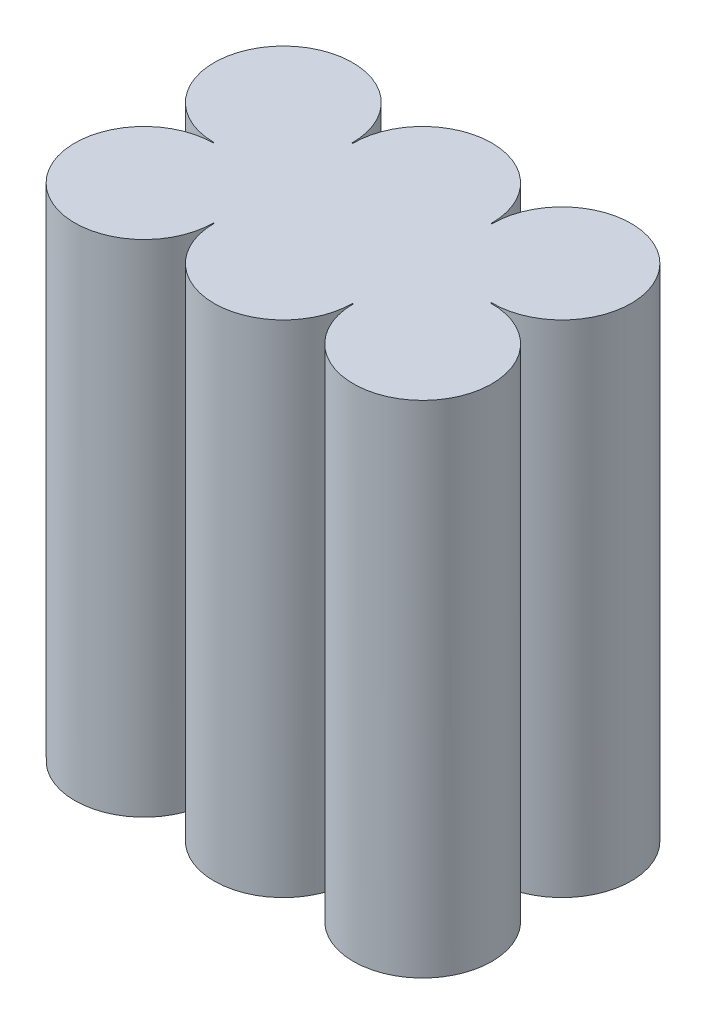
ISO-10303-21;
HEADER;
FILE_DESCRIPTION(('STEP AP214'),'2;1');
FILE_NAME('part.step','',(''),(''),'','','');
FILE_SCHEMA(('AUTOMOTIVE_DESIGN { 1 0 10303 214 1 1 1 1 }'));
ENDSEC;
DATA;
#1=APPLICATION_CONTEXT('core data for automotive mechanical design processes');
#2=APPLICATION_PROTOCOL_DEFINITION('international standard','automotive_design',2000,#1);
#3=PRODUCT_CONTEXT('',#1,'mechanical');
#4=PRODUCT('Part','Part','',(#3));
#5=PRODUCT_RELATED_PRODUCT_CATEGORY('part','',(#4));
#6=PRODUCT_DEFINITION_FORMATION('','',#4);
#7=PRODUCT_DEFINITION_CONTEXT('part definition',#1,'design');
#8=PRODUCT_DEFINITION('design','',#6,#7);
#9=PRODUCT_DEFINITION_SHAPE('','',#8);
#10=(LENGTH_UNIT() NAMED_UNIT(*) SI_UNIT(.MILLI.,.METRE.));
#11=(NAMED_UNIT(*) PLANE_ANGLE_UNIT() SI_UNIT($,.RADIAN.));
#12=(NAMED_UNIT(*) SI_UNIT($,.STERADIAN.) SOLID_ANGLE_UNIT());
#13=UNCERTAINTY_MEASURE_WITH_UNIT(LENGTH_MEASURE(1.E-05),#10,'distance_accuracy_value','');
#14=(GEOMETRIC_REPRESENTATION_CONTEXT(3) GLOBAL_UNCERTAINTY_ASSIGNED_CONTEXT((#13)) GLOBAL_UNIT_ASSIGNED_CONTEXT((#10,
#11,#12)) REPRESENTATION_CONTEXT('',''));
#15=CARTESIAN_POINT('',(0.,0.,0.));
#16=DIRECTION('',(0.,0.,1.));
#17=DIRECTION('',(1.,0.,0.));
#18=AXIS2_PLACEMENT_3D('',#15,#16,#17);
#19=CARTESIAN_POINT('',(36.,55.,0.));
#20=DIRECTION('',(1.,0.,0.));
#21=DIRECTION('',(0.,0.,-1.));
#22=AXIS2_PLACEMENT_3D('',#19,#20,#21);
#23=PLANE('',#22);
#24=DIRECTION('',(0.,0.,-1.));
#25=VECTOR('',#24,1.);
#26=CARTESIAN_POINT('',(36.,55.,0.));
#27=LINE('',#26,#25);
#28=CARTESIAN_POINT('',(36.,55.,-8.99777750336159));
#29=VERTEX_POINT('',#28);
#30=CARTESIAN_POINT('',(36.,55.,-9.10222249663841));
#31=VERTEX_POINT('',#30);
#32=EDGE_CURVE('E189',#29,#31,#27,.T.);
#33=ORIENTED_EDGE('',*,*,#32,.T.);
#34=DIRECTION('',(0.,-1.,0.));
#35=VECTOR('',#34,1.);
#36=CARTESIAN_POINT('',(36.,65.,-9.10222249663841));
#37=LINE('',#36,#35);
#38=CARTESIAN_POINT('',(36.,65.,-9.10222249663841));
#39=VERTEX_POINT('',#38);
#40=EDGE_CURVE('E56',#31,#39,#37,.F.);
#41=ORIENTED_EDGE('',*,*,#40,.T.);
#42=DIRECTION('',(0.,0.,-1.));
#43=VECTOR('',#42,1.);
#44=CARTESIAN_POINT('',(36.,65.,0.));
#45=LINE('',#44,#43);
#46=CARTESIAN_POINT('',(36.,65.,-8.99777750336159));
#47=VERTEX_POINT('',#46);
#48=EDGE_CURVE('E144',#47,#39,#45,.T.);
#49=ORIENTED_EDGE('',*,*,#48,.F.);
#50=DIRECTION('',(0.,-1.,0.));
#51=VECTOR('',#50,1.);
#52=CARTESIAN_POINT('',(36.,65.,-8.99777750336159));
#53=LINE('',#52,#51);
#54=EDGE_CURVE('E265',#47,#29,#53,.T.);
#55=ORIENTED_EDGE('',*,*,#54,.T.);
#56=EDGE_LOOP('',(#33,#41,#49,#55));
#57=FACE_BOUND('',#56,.T.);
#58=ADVANCED_FACE('F41',(#57),#23,.T.);
#59=CARTESIAN_POINT('',(0.,55.,-18.));
#60=DIRECTION('',(0.,0.,-1.));
#61=DIRECTION('',(-1.,0.,0.));
#62=AXIS2_PLACEMENT_3D('',#59,#60,#61);
#63=PLANE('',#62);
#64=DIRECTION('',(-1.,0.,0.));
#65=VECTOR('',#64,1.);
#66=CARTESIAN_POINT('',(0.,65.,-18.));
#67=LINE('',#66,#65);
#68=CARTESIAN_POINT('',(27.2005555727034,65.,-18.));
#69=VERTEX_POINT('',#68);
#70=CARTESIAN_POINT('',(27.0994444272966,65.,-18.));
#71=VERTEX_POINT('',#70);
#72=EDGE_CURVE('E140',#69,#71,#67,.T.);
#73=ORIENTED_EDGE('',*,*,#72,.F.);
#74=DIRECTION('',(0.,-1.,0.));
#75=VECTOR('',#74,1.);
#76=CARTESIAN_POINT('',(27.2005555727034,65.,-18.));
#77=LINE('',#76,#75);
#78=CARTESIAN_POINT('',(27.2005555727034,55.,-18.));
#79=VERTEX_POINT('',#78);
#80=EDGE_CURVE('E127',#69,#79,#77,.T.);
#81=ORIENTED_EDGE('',*,*,#80,.T.);
#82=DIRECTION('',(-1.,0.,0.));
#83=VECTOR('',#82,1.);
#84=CARTESIAN_POINT('',(0.,55.,-18.));
#85=LINE('',#84,#83);
#86=CARTESIAN_POINT('',(27.0994444272966,55.,-18.));
#87=VERTEX_POINT('',#86);
#88=EDGE_CURVE('E163',#79,#87,#85,.T.);
#89=ORIENTED_EDGE('',*,*,#88,.T.);
#90=DIRECTION('',(0.,-1.,0.));
#91=VECTOR('',#90,1.);
#92=CARTESIAN_POINT('',(27.0994444272966,65.,-18.));
#93=LINE('',#92,#91);
#94=EDGE_CURVE('E150',#87,#71,#93,.F.);
#95=ORIENTED_EDGE('',*,*,#94,.T.);
#96=EDGE_LOOP('',(#73,#81,#89,#95));
#97=FACE_BOUND('',#96,.T.);
#98=ADVANCED_FACE('F148',(#97),#63,.T.);
#99=CARTESIAN_POINT('',(0.,55.,0.));
#100=DIRECTION('',(0.,0.,1.));
#101=DIRECTION('',(1.,0.,0.));
#102=AXIS2_PLACEMENT_3D('',#99,#100,#101);
#103=PLANE('',#102);
#104=DIRECTION('',(1.,0.,0.));
#105=VECTOR('',#104,1.);
#106=CARTESIAN_POINT('',(0.,55.,0.));
#107=LINE('',#106,#105);
#108=CARTESIAN_POINT('',(27.1,55.,0.));
#109=VERTEX_POINT('',#108);
#110=CARTESIAN_POINT('',(27.2,55.,0.));
#111=VERTEX_POINT('',#110);
#112=EDGE_CURVE('E154',#109,#111,#107,.T.);
#113=ORIENTED_EDGE('',*,*,#112,.T.);
#114=DIRECTION('',(0.,-1.,0.));
#115=VECTOR('',#114,1.);
#116=CARTESIAN_POINT('',(27.2,65.,0.));
#117=LINE('',#116,#115);
#118=CARTESIAN_POINT('',(27.2,65.,0.));
#119=VERTEX_POINT('',#118);
#120=EDGE_CURVE('E63',#111,#119,#117,.F.);
#121=ORIENTED_EDGE('',*,*,#120,.T.);
#122=DIRECTION('',(1.,0.,0.));
#123=VECTOR('',#122,1.);
#124=CARTESIAN_POINT('',(0.,65.,0.));
#125=LINE('',#124,#123);
#126=CARTESIAN_POINT('',(27.1,65.,0.));
#127=VERTEX_POINT('',#126);
#128=EDGE_CURVE('E206',#127,#119,#125,.T.);
#129=ORIENTED_EDGE('',*,*,#128,.F.);
#130=DIRECTION('',(0.,-1.,0.));
#131=VECTOR('',#130,1.);
#132=CARTESIAN_POINT('',(27.1,65.,0.));
#133=LINE('',#132,#131);
#134=EDGE_CURVE('E196',#127,#109,#133,.T.);
#135=ORIENTED_EDGE('',*,*,#134,.T.);
#136=EDGE_LOOP('',(#113,#121,#129,#135));
#137=FACE_BOUND('',#136,.T.);
#138=ADVANCED_FACE('F193',(#137),#103,.T.);
#139=CARTESIAN_POINT('',(9.10055557270339,65.,-18.));
#140=VERTEX_POINT('',#139);
#141=CARTESIAN_POINT('',(8.99944442729661,65.,-18.));
#142=VERTEX_POINT('',#141);
#143=EDGE_CURVE('E152',#140,#142,#67,.T.);
#144=ORIENTED_EDGE('',*,*,#143,.F.);
#145=DIRECTION('',(0.,-1.,0.));
#146=VECTOR('',#145,1.);
#147=CARTESIAN_POINT('',(9.10055557270339,65.,-18.));
#148=LINE('',#147,#146);
#149=CARTESIAN_POINT('',(9.10055557270339,55.,-18.));
#150=VERTEX_POINT('',#149);
#151=EDGE_CURVE('E254',#140,#150,#148,.T.);
#152=ORIENTED_EDGE('',*,*,#151,.T.);
#153=CARTESIAN_POINT('',(8.99944442729661,55.,-18.));
#154=VERTEX_POINT('',#153);
#155=EDGE_CURVE('E203',#150,#154,#85,.T.);
#156=ORIENTED_EDGE('',*,*,#155,.T.);
#157=DIRECTION('',(0.,-1.,0.));
#158=VECTOR('',#157,1.);
#159=CARTESIAN_POINT('',(8.99944442729661,65.,-18.));
#160=LINE('',#159,#158);
#161=EDGE_CURVE('E229',#154,#142,#160,.F.);
#162=ORIENTED_EDGE('',*,*,#161,.T.);
#163=EDGE_LOOP('',(#144,#152,#156,#162));
#164=FACE_BOUND('',#163,.T.);
#165=ADVANCED_FACE('F252',(#164),#63,.T.);
#166=CARTESIAN_POINT('',(9.,55.,0.));
#167=VERTEX_POINT('',#166);
#168=CARTESIAN_POINT('',(9.1,55.,0.));
#169=VERTEX_POINT('',#168);
#170=EDGE_CURVE('E197',#167,#169,#107,.T.);
#171=ORIENTED_EDGE('',*,*,#170,.T.);
#172=DIRECTION('',(0.,-1.,0.));
#173=VECTOR('',#172,1.);
#174=CARTESIAN_POINT('',(9.1,65.,0.));
#175=LINE('',#174,#173);
#176=CARTESIAN_POINT('',(9.1,65.,0.));
#177=VERTEX_POINT('',#176);
#178=EDGE_CURVE('E217',#169,#177,#175,.F.);
#179=ORIENTED_EDGE('',*,*,#178,.T.);
#180=CARTESIAN_POINT('',(9.,65.,0.));
#181=VERTEX_POINT('',#180);
#182=EDGE_CURVE('E208',#181,#177,#125,.T.);
#183=ORIENTED_EDGE('',*,*,#182,.F.);
#184=DIRECTION('',(0.,-1.,0.));
#185=VECTOR('',#184,1.);
#186=CARTESIAN_POINT('',(9.,65.,0.));
#187=LINE('',#186,#185);
#188=EDGE_CURVE('E159',#167,#181,#187,.F.);
#189=ORIENTED_EDGE('',*,*,#188,.F.);
#190=EDGE_LOOP('',(#171,#179,#183,#189));
#191=FACE_BOUND('',#190,.T.);
#192=ADVANCED_FACE('F292',(#191),#103,.T.);
#193=CARTESIAN_POINT('',(0.,55.,0.));
#194=DIRECTION('',(-1.,0.,0.));
#195=DIRECTION('',(0.,0.,1.));
#196=AXIS2_PLACEMENT_3D('',#193,#194,#195);
#197=PLANE('',#196);
#198=DIRECTION('',(0.,0.,1.));
#199=VECTOR('',#198,1.);
#200=CARTESIAN_POINT('',(0.,65.,0.));
#201=LINE('',#200,#199);
#202=CARTESIAN_POINT('',(0.,65.,-9.1));
#203=VERTEX_POINT('',#202);
#204=CARTESIAN_POINT('',(0.,65.,-9.));
#205=VERTEX_POINT('',#204);
#206=EDGE_CURVE('E205',#203,#205,#201,.T.);
#207=ORIENTED_EDGE('',*,*,#206,.F.);
#208=DIRECTION('',(0.,-1.,0.));
#209=VECTOR('',#208,1.);
#210=CARTESIAN_POINT('',(0.,65.,-9.1));
#211=LINE('',#210,#209);
#212=CARTESIAN_POINT('',(0.,55.,-9.1));
#213=VERTEX_POINT('',#212);
#214=EDGE_CURVE('E207',#203,#213,#211,.T.);
#215=ORIENTED_EDGE('',*,*,#214,.T.);
#216=DIRECTION('',(0.,0.,1.));
#217=VECTOR('',#216,1.);
#218=CARTESIAN_POINT('',(0.,55.,0.));
#219=LINE('',#218,#217);
#220=CARTESIAN_POINT('',(0.,55.,-9.));
#221=VERTEX_POINT('',#220);
#222=EDGE_CURVE('E151',#213,#221,#219,.T.);
#223=ORIENTED_EDGE('',*,*,#222,.T.);
#224=DIRECTION('',(0.,-1.,0.));
#225=VECTOR('',#224,1.);
#226=CARTESIAN_POINT('',(0.,65.,-9.));
#227=LINE('',#226,#225);
#228=EDGE_CURVE('E162',#205,#221,#227,.T.);
#229=ORIENTED_EDGE('',*,*,#228,.F.);
#230=EDGE_LOOP('',(#207,#215,#223,#229));
#231=FACE_BOUND('',#230,.T.);
#232=ADVANCED_FACE('F237',(#231),#197,.T.);
#233=CARTESIAN_POINT('',(0.,65.,0.));
#234=DIRECTION('',(0.,-1.,0.));
#235=DIRECTION('',(0.,0.,-1.));
#236=AXIS2_PLACEMENT_3D('',#233,#234,#235);
#237=CYLINDRICAL_SURFACE('',#236,9.);
#238=CARTESIAN_POINT('',(0.,65.,0.));
#239=DIRECTION('',(0.,1.,0.));
#240=DIRECTION('',(0.,0.,1.));
#241=AXIS2_PLACEMENT_3D('',#238,#239,#240);
#242=CIRCLE('',#241,9.);
#243=EDGE_CURVE('E167',#205,#181,#242,.T.);
#244=ORIENTED_EDGE('',*,*,#243,.F.);
#245=ORIENTED_EDGE('',*,*,#228,.T.);
#246=CARTESIAN_POINT('',(0.,55.,0.));
#247=DIRECTION('',(0.,-1.,0.));
#248=DIRECTION('',(0.,0.,-1.));
#249=AXIS2_PLACEMENT_3D('',#246,#247,#248);
#250=CIRCLE('',#249,9.);
#251=EDGE_CURVE('E170',#221,#167,#250,.T.);
#252=ORIENTED_EDGE('',*,*,#251,.T.);
#253=ORIENTED_EDGE('',*,*,#188,.T.);
#254=EDGE_LOOP('',(#244,#245,#252,#253));
#255=FACE_BOUND('',#254,.T.);
#256=CARTESIAN_POINT('',(0.,0.,0.));
#257=DIRECTION('',(0.,1.,0.));
#258=DIRECTION('',(0.,0.,1.));
#259=AXIS2_PLACEMENT_3D('',#256,#257,#258);
#260=CIRCLE('',#259,9.);
#261=CARTESIAN_POINT('',(0.,0.,9.));
#262=VERTEX_POINT('',#261);
#263=EDGE_CURVE('E166',#262,#262,#260,.T.);
#264=ORIENTED_EDGE('',*,*,#263,.T.);
#265=EDGE_LOOP('',(#264));
#266=FACE_BOUND('',#265,.T.);
#267=ADVANCED_FACE('F43',(#255,#266),#237,.T.);
#268=CARTESIAN_POINT('',(0.,65.,0.));
#269=DIRECTION('',(0.,1.,0.));
#270=DIRECTION('',(0.,0.,1.));
#271=AXIS2_PLACEMENT_3D('',#268,#269,#270);
#272=PLANE('',#271);
#273=ORIENTED_EDGE('',*,*,#48,.T.);
#274=CARTESIAN_POINT('',(36.2,65.,-18.1));
#275=DIRECTION('',(0.,1.,0.));
#276=DIRECTION('',(0.,0.,1.));
#277=AXIS2_PLACEMENT_3D('',#274,#275,#276);
#278=CIRCLE('',#277,9.);
#279=EDGE_CURVE('E131',#39,#69,#278,.T.);
#280=ORIENTED_EDGE('',*,*,#279,.T.);
#281=ORIENTED_EDGE('',*,*,#72,.T.);
#282=CARTESIAN_POINT('',(18.1,65.,-18.1));
#283=DIRECTION('',(0.,1.,0.));
#284=DIRECTION('',(0.,0.,1.));
#285=AXIS2_PLACEMENT_3D('',#282,#283,#284);
#286=CIRCLE('',#285,9.);
#287=EDGE_CURVE('E258',#71,#140,#286,.T.);
#288=ORIENTED_EDGE('',*,*,#287,.T.);
#289=ORIENTED_EDGE('',*,*,#143,.T.);
#290=CARTESIAN_POINT('',(0.,65.,-18.1));
#291=DIRECTION('',(0.,1.,0.));
#292=DIRECTION('',(0.,0.,1.));
#293=AXIS2_PLACEMENT_3D('',#290,#291,#292);
#294=CIRCLE('',#293,9.);
#295=EDGE_CURVE('E226',#142,#203,#294,.T.);
#296=ORIENTED_EDGE('',*,*,#295,.T.);
#297=ORIENTED_EDGE('',*,*,#206,.T.);
#298=ORIENTED_EDGE('',*,*,#243,.T.);
#299=ORIENTED_EDGE('',*,*,#182,.T.);
#300=CARTESIAN_POINT('',(18.1,65.,0.));
#301=DIRECTION('',(0.,1.,0.));
#302=DIRECTION('',(0.,0.,1.));
#303=AXIS2_PLACEMENT_3D('',#300,#301,#302);
#304=CIRCLE('',#303,9.);
#305=EDGE_CURVE('E212',#177,#127,#304,.T.);
#306=ORIENTED_EDGE('',*,*,#305,.T.);
#307=ORIENTED_EDGE('',*,*,#128,.T.);
#308=CARTESIAN_POINT('',(36.2,65.,0.));
#309=DIRECTION('',(0.,1.,0.));
#310=DIRECTION('',(0.,0.,1.));
#311=AXIS2_PLACEMENT_3D('',#308,#309,#310);
#312=CIRCLE('',#311,9.);
#313=EDGE_CURVE('E211',#119,#47,#312,.T.);
#314=ORIENTED_EDGE('',*,*,#313,.T.);
#315=EDGE_LOOP('',(#273,#280,#281,#288,#289,#296,#297,#298,#299,#306,#307,#314));
#316=FACE_BOUND('',#315,.T.);
#317=ADVANCED_FACE('F138',(#316),#272,.T.);
#318=CARTESIAN_POINT('',(0.,0.,0.));
#319=DIRECTION('',(0.,1.,0.));
#320=DIRECTION('',(0.,0.,1.));
#321=AXIS2_PLACEMENT_3D('',#318,#319,#320);
#322=PLANE('',#321);
#323=ORIENTED_EDGE('',*,*,#263,.F.);
#324=EDGE_LOOP('',(#323));
#325=FACE_BOUND('',#324,.T.);
#326=ADVANCED_FACE('F299',(#325),#322,.F.);
#327=CARTESIAN_POINT('',(0.,55.,0.));
#328=DIRECTION('',(0.,-1.,0.));
#329=DIRECTION('',(0.,0.,-1.));
#330=AXIS2_PLACEMENT_3D('',#327,#328,#329);
#331=PLANE('',#330);
#332=ORIENTED_EDGE('',*,*,#88,.F.);
#333=CARTESIAN_POINT('',(36.2,55.,-18.1));
#334=DIRECTION('',(0.,-1.,0.));
#335=DIRECTION('',(0.,0.,-1.));
#336=AXIS2_PLACEMENT_3D('',#333,#334,#335);
#337=CIRCLE('',#336,9.);
#338=EDGE_CURVE('E11',#79,#31,#337,.F.);
#339=ORIENTED_EDGE('',*,*,#338,.T.);
#340=ORIENTED_EDGE('',*,*,#32,.F.);
#341=CARTESIAN_POINT('',(36.2,55.,0.));
#342=DIRECTION('',(0.,-1.,0.));
#343=DIRECTION('',(0.,0.,-1.));
#344=AXIS2_PLACEMENT_3D('',#341,#342,#343);
#345=CIRCLE('',#344,9.);
#346=EDGE_CURVE('E49',#29,#111,#345,.F.);
#347=ORIENTED_EDGE('',*,*,#346,.T.);
#348=ORIENTED_EDGE('',*,*,#112,.F.);
#349=CARTESIAN_POINT('',(18.1,55.,0.));
#350=DIRECTION('',(0.,-1.,0.));
#351=DIRECTION('',(0.,0.,-1.));
#352=AXIS2_PLACEMENT_3D('',#349,#350,#351);
#353=CIRCLE('',#352,9.);
#354=EDGE_CURVE('E178',#109,#169,#353,.F.);
#355=ORIENTED_EDGE('',*,*,#354,.T.);
#356=ORIENTED_EDGE('',*,*,#170,.F.);
#357=ORIENTED_EDGE('',*,*,#251,.F.);
#358=ORIENTED_EDGE('',*,*,#222,.F.);
#359=CARTESIAN_POINT('',(0.,55.,-18.1));
#360=DIRECTION('',(0.,-1.,0.));
#361=DIRECTION('',(0.,0.,-1.));
#362=AXIS2_PLACEMENT_3D('',#359,#360,#361);
#363=CIRCLE('',#362,9.);
#364=EDGE_CURVE('E175',#213,#154,#363,.F.);
#365=ORIENTED_EDGE('',*,*,#364,.T.);
#366=ORIENTED_EDGE('',*,*,#155,.F.);
#367=CARTESIAN_POINT('',(18.1,55.,-18.1));
#368=DIRECTION('',(0.,-1.,0.));
#369=DIRECTION('',(0.,0.,-1.));
#370=AXIS2_PLACEMENT_3D('',#367,#368,#369);
#371=CIRCLE('',#370,9.);
#372=EDGE_CURVE('E181',#150,#87,#371,.F.);
#373=ORIENTED_EDGE('',*,*,#372,.T.);
#374=EDGE_LOOP('',(#332,#339,#340,#347,#348,#355,#356,#357,#358,#365,#366,#373));
#375=FACE_BOUND('',#374,.T.);
#376=ADVANCED_FACE('F187',(#375),#331,.T.);
#377=CARTESIAN_POINT('',(0.,65.,-18.1));
#378=DIRECTION('',(0.,-1.,0.));
#379=DIRECTION('',(0.,0.,-1.));
#380=AXIS2_PLACEMENT_3D('',#377,#378,#379);
#381=CYLINDRICAL_SURFACE('',#380,9.);
#382=ORIENTED_EDGE('',*,*,#214,.F.);
#383=ORIENTED_EDGE('',*,*,#295,.F.);
#384=ORIENTED_EDGE('',*,*,#161,.F.);
#385=ORIENTED_EDGE('',*,*,#364,.F.);
#386=EDGE_LOOP('',(#382,#383,#384,#385));
#387=FACE_BOUND('',#386,.T.);
#388=CARTESIAN_POINT('',(0.,0.,-18.1));
#389=DIRECTION('',(0.,1.,0.));
#390=DIRECTION('',(0.,0.,1.));
#391=AXIS2_PLACEMENT_3D('',#388,#389,#390);
#392=CIRCLE('',#391,9.);
#393=CARTESIAN_POINT('',(0.,0.,-9.1));
#394=VERTEX_POINT('',#393);
#395=EDGE_CURVE('E225',#394,#394,#392,.T.);
#396=ORIENTED_EDGE('',*,*,#395,.T.);
#397=EDGE_LOOP('',(#396));
#398=FACE_BOUND('',#397,.T.);
#399=ADVANCED_FACE('F249',(#387,#398),#381,.T.);
#400=CARTESIAN_POINT('',(0.,0.,-18.1));
#401=DIRECTION('',(0.,1.,0.));
#402=DIRECTION('',(0.,0.,1.));
#403=AXIS2_PLACEMENT_3D('',#400,#401,#402);
#404=PLANE('',#403);
#405=ORIENTED_EDGE('',*,*,#395,.F.);
#406=EDGE_LOOP('',(#405));
#407=FACE_BOUND('',#406,.T.);
#408=ADVANCED_FACE('F333',(#407),#404,.F.);
#409=CARTESIAN_POINT('',(18.1,65.,0.));
#410=DIRECTION('',(0.,-1.,0.));
#411=DIRECTION('',(0.,0.,-1.));
#412=AXIS2_PLACEMENT_3D('',#409,#410,#411);
#413=CYLINDRICAL_SURFACE('',#412,9.);
#414=ORIENTED_EDGE('',*,*,#178,.F.);
#415=ORIENTED_EDGE('',*,*,#354,.F.);
#416=ORIENTED_EDGE('',*,*,#134,.F.);
#417=ORIENTED_EDGE('',*,*,#305,.F.);
#418=EDGE_LOOP('',(#414,#415,#416,#417));
#419=FACE_BOUND('',#418,.T.);
#420=CARTESIAN_POINT('',(18.1,0.,0.));
#421=DIRECTION('',(0.,1.,0.));
#422=DIRECTION('',(0.,0.,1.));
#423=AXIS2_PLACEMENT_3D('',#420,#421,#422);
#424=CIRCLE('',#423,9.);
#425=CARTESIAN_POINT('',(18.1,0.,9.));
#426=VERTEX_POINT('',#425);
#427=EDGE_CURVE('E215',#426,#426,#424,.T.);
#428=ORIENTED_EDGE('',*,*,#427,.T.);
#429=EDGE_LOOP('',(#428));
#430=FACE_BOUND('',#429,.T.);
#431=ADVANCED_FACE('F342',(#419,#430),#413,.T.);
#432=CARTESIAN_POINT('',(18.1,0.,0.));
#433=DIRECTION('',(0.,1.,0.));
#434=DIRECTION('',(0.,0.,1.));
#435=AXIS2_PLACEMENT_3D('',#432,#433,#434);
#436=PLANE('',#435);
#437=ORIENTED_EDGE('',*,*,#427,.F.);
#438=EDGE_LOOP('',(#437));
#439=FACE_BOUND('',#438,.T.);
#440=ADVANCED_FACE('F352',(#439),#436,.F.);
#441=CARTESIAN_POINT('',(18.1,65.,-18.1));
#442=DIRECTION('',(0.,-1.,0.));
#443=DIRECTION('',(0.,0.,-1.));
#444=AXIS2_PLACEMENT_3D('',#441,#442,#443);
#445=CYLINDRICAL_SURFACE('',#444,9.);
#446=ORIENTED_EDGE('',*,*,#94,.F.);
#447=ORIENTED_EDGE('',*,*,#372,.F.);
#448=ORIENTED_EDGE('',*,*,#151,.F.);
#449=ORIENTED_EDGE('',*,*,#287,.F.);
#450=EDGE_LOOP('',(#446,#447,#448,#449));
#451=FACE_BOUND('',#450,.T.);
#452=CARTESIAN_POINT('',(18.1,0.,-18.1));
#453=DIRECTION('',(0.,1.,0.));
#454=DIRECTION('',(0.,0.,1.));
#455=AXIS2_PLACEMENT_3D('',#452,#453,#454);
#456=CIRCLE('',#455,9.);
#457=CARTESIAN_POINT('',(18.1,0.,-9.1));
#458=VERTEX_POINT('',#457);
#459=EDGE_CURVE('E259',#458,#458,#456,.T.);
#460=ORIENTED_EDGE('',*,*,#459,.T.);
#461=EDGE_LOOP('',(#460));
#462=FACE_BOUND('',#461,.T.);
#463=ADVANCED_FACE('F256',(#451,#462),#445,.T.);
#464=CARTESIAN_POINT('',(18.1,0.,-18.1));
#465=DIRECTION('',(0.,1.,0.));
#466=DIRECTION('',(0.,0.,1.));
#467=AXIS2_PLACEMENT_3D('',#464,#465,#466);
#468=PLANE('',#467);
#469=ORIENTED_EDGE('',*,*,#459,.F.);
#470=EDGE_LOOP('',(#469));
#471=FACE_BOUND('',#470,.T.);
#472=ADVANCED_FACE('F370',(#471),#468,.F.);
#473=CARTESIAN_POINT('',(36.2,65.,0.));
#474=DIRECTION('',(0.,-1.,0.));
#475=DIRECTION('',(0.,0.,-1.));
#476=AXIS2_PLACEMENT_3D('',#473,#474,#475);
#477=CYLINDRICAL_SURFACE('',#476,9.);
#478=ORIENTED_EDGE('',*,*,#120,.F.);
#479=ORIENTED_EDGE('',*,*,#346,.F.);
#480=ORIENTED_EDGE('',*,*,#54,.F.);
#481=ORIENTED_EDGE('',*,*,#313,.F.);
#482=EDGE_LOOP('',(#478,#479,#480,#481));
#483=FACE_BOUND('',#482,.T.);
#484=CARTESIAN_POINT('',(36.2,0.,0.));
#485=DIRECTION('',(0.,1.,0.));
#486=DIRECTION('',(0.,0.,1.));
#487=AXIS2_PLACEMENT_3D('',#484,#485,#486);
#488=CIRCLE('',#487,9.);
#489=CARTESIAN_POINT('',(36.2,0.,9.));
#490=VERTEX_POINT('',#489);
#491=EDGE_CURVE('E267',#490,#490,#488,.T.);
#492=ORIENTED_EDGE('',*,*,#491,.T.);
#493=EDGE_LOOP('',(#492));
#494=FACE_BOUND('',#493,.T.);
#495=ADVANCED_FACE('F379',(#483,#494),#477,.T.);
#496=CARTESIAN_POINT('',(36.2,0.,0.));
#497=DIRECTION('',(0.,1.,0.));
#498=DIRECTION('',(0.,0.,1.));
#499=AXIS2_PLACEMENT_3D('',#496,#497,#498);
#500=PLANE('',#499);
#501=ORIENTED_EDGE('',*,*,#491,.F.);
#502=EDGE_LOOP('',(#501));
#503=FACE_BOUND('',#502,.T.);
#504=ADVANCED_FACE('F281',(#503),#500,.F.);
#505=CARTESIAN_POINT('',(36.2,65.,-18.1));
#506=DIRECTION('',(0.,-1.,0.));
#507=DIRECTION('',(0.,0.,-1.));
#508=AXIS2_PLACEMENT_3D('',#505,#506,#507);
#509=CYLINDRICAL_SURFACE('',#508,9.);
#510=ORIENTED_EDGE('',*,*,#40,.F.);
#511=ORIENTED_EDGE('',*,*,#338,.F.);
#512=ORIENTED_EDGE('',*,*,#80,.F.);
#513=ORIENTED_EDGE('',*,*,#279,.F.);
#514=EDGE_LOOP('',(#510,#511,#512,#513));
#515=FACE_BOUND('',#514,.T.);
#516=CARTESIAN_POINT('',(36.2,0.,-18.1));
#517=DIRECTION('',(0.,1.,0.));
#518=DIRECTION('',(0.,0.,1.));
#519=AXIS2_PLACEMENT_3D('',#516,#517,#518);
#520=CIRCLE('',#519,9.);
#521=CARTESIAN_POINT('',(36.2,0.,-9.1));
#522=VERTEX_POINT('',#521);
#523=EDGE_CURVE('E145',#522,#522,#520,.T.);
#524=ORIENTED_EDGE('',*,*,#523,.T.);
#525=EDGE_LOOP('',(#524));
#526=FACE_BOUND('',#525,.T.);
#527=ADVANCED_FACE('F129',(#515,#526),#509,.T.);
#528=CARTESIAN_POINT('',(36.2,0.,-18.1));
#529=DIRECTION('',(0.,1.,0.));
#530=DIRECTION('',(0.,0.,1.));
#531=AXIS2_PLACEMENT_3D('',#528,#529,#530);
#532=PLANE('',#531);
#533=ORIENTED_EDGE('',*,*,#523,.F.);
#534=EDGE_LOOP('',(#533));
#535=FACE_BOUND('',#534,.T.);
#536=ADVANCED_FACE('F275',(#535),#532,.F.);
#537=CLOSED_SHELL('',(#58,#98,#138,#165,#192,#232,#267,#317,#326,#376,#399,#408,#431,#440,#463,
#472,#495,#504,#527,#536));
#538=MANIFOLD_SOLID_BREP('B2',#537);
#539=ADVANCED_BREP_SHAPE_REPRESENTATION('',(#18,#538),#14);
#540=SHAPE_DEFINITION_REPRESENTATION(#9,#539);
ENDSEC;
END-ISO-10303-21;
